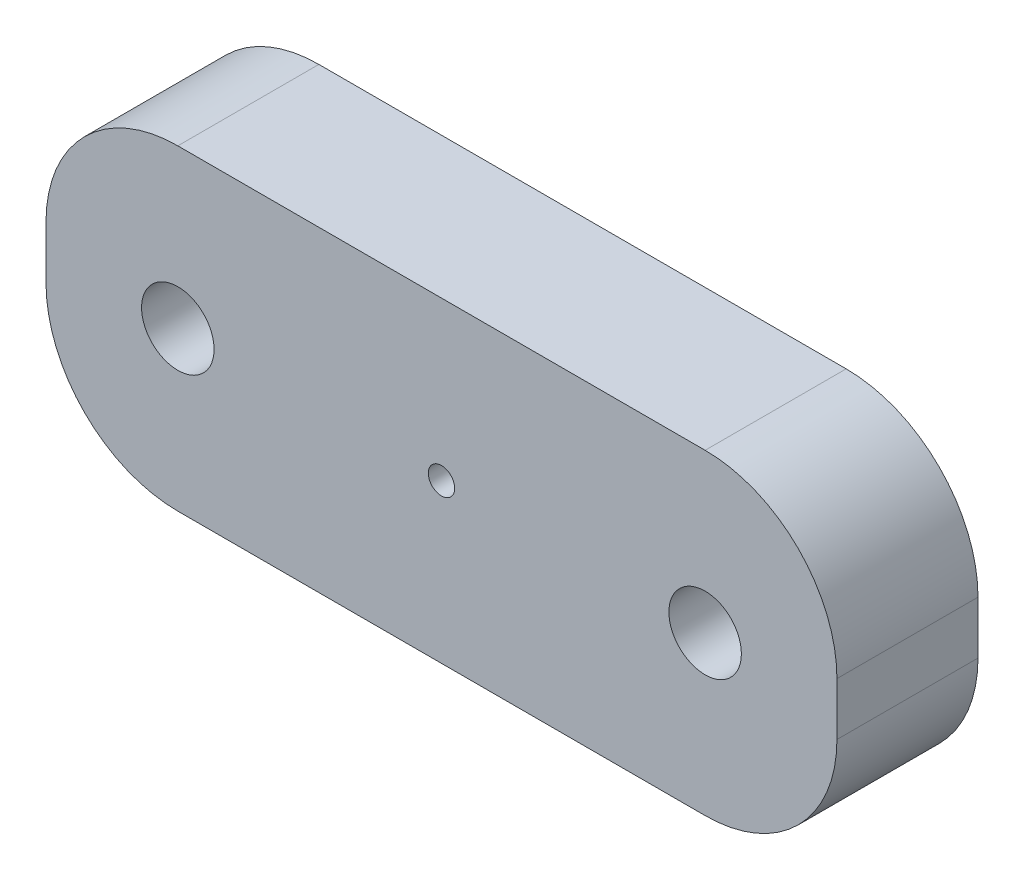
ISO-10303-21;
HEADER;
FILE_DESCRIPTION(('STEP AP214'),'2;1');
FILE_NAME('part.step','',(''),(''),'','','');
FILE_SCHEMA(('AUTOMOTIVE_DESIGN { 1 0 10303 214 1 1 1 1 }'));
ENDSEC;
DATA;
#1=APPLICATION_CONTEXT('core data for automotive mechanical design processes');
#2=APPLICATION_PROTOCOL_DEFINITION('international standard','automotive_design',2000,#1);
#3=PRODUCT_CONTEXT('',#1,'mechanical');
#4=PRODUCT('Part','Part','',(#3));
#5=PRODUCT_RELATED_PRODUCT_CATEGORY('part','',(#4));
#6=PRODUCT_DEFINITION_FORMATION('','',#4);
#7=PRODUCT_DEFINITION_CONTEXT('part definition',#1,'design');
#8=PRODUCT_DEFINITION('design','',#6,#7);
#9=PRODUCT_DEFINITION_SHAPE('','',#8);
#10=(LENGTH_UNIT() NAMED_UNIT(*) SI_UNIT(.MILLI.,.METRE.));
#11=(NAMED_UNIT(*) PLANE_ANGLE_UNIT() SI_UNIT($,.RADIAN.));
#12=(NAMED_UNIT(*) SI_UNIT($,.STERADIAN.) SOLID_ANGLE_UNIT());
#13=UNCERTAINTY_MEASURE_WITH_UNIT(LENGTH_MEASURE(1.E-05),#10,'distance_accuracy_value','');
#14=(GEOMETRIC_REPRESENTATION_CONTEXT(3) GLOBAL_UNCERTAINTY_ASSIGNED_CONTEXT((#13)) GLOBAL_UNIT_ASSIGNED_CONTEXT((#10,
#11,#12)) REPRESENTATION_CONTEXT('',''));
#15=CARTESIAN_POINT('',(0.,0.,0.));
#16=DIRECTION('',(0.,0.,1.));
#17=DIRECTION('',(1.,0.,0.));
#18=AXIS2_PLACEMENT_3D('',#15,#16,#17);
#19=CARTESIAN_POINT('',(0.,0.,5.35));
#20=DIRECTION('',(0.,1.,0.));
#21=DIRECTION('',(0.,0.,1.));
#22=AXIS2_PLACEMENT_3D('',#19,#20,#21);
#23=PLANE('',#22);
#24=DIRECTION('',(1.,0.,0.));
#25=VECTOR('',#24,1.);
#26=CARTESIAN_POINT('',(0.,0.,0.));
#27=LINE('',#26,#25);
#28=CARTESIAN_POINT('',(-10.,0.,0.));
#29=VERTEX_POINT('',#28);
#30=CARTESIAN_POINT('',(10.,0.,0.));
#31=VERTEX_POINT('',#30);
#32=EDGE_CURVE('E140',#29,#31,#27,.T.);
#33=ORIENTED_EDGE('',*,*,#32,.T.);
#34=DIRECTION('',(0.,0.,-1.));
#35=VECTOR('',#34,1.);
#36=CARTESIAN_POINT('',(10.,0.,5.35));
#37=LINE('',#36,#35);
#38=CARTESIAN_POINT('',(10.,0.,5.35));
#39=VERTEX_POINT('',#38);
#40=EDGE_CURVE('E11',#39,#31,#37,.T.);
#41=ORIENTED_EDGE('',*,*,#40,.F.);
#42=DIRECTION('',(1.,0.,0.));
#43=VECTOR('',#42,1.);
#44=CARTESIAN_POINT('',(0.,0.,5.35));
#45=LINE('',#44,#43);
#46=CARTESIAN_POINT('',(-10.,0.,5.35));
#47=VERTEX_POINT('',#46);
#48=EDGE_CURVE('E193',#47,#39,#45,.T.);
#49=ORIENTED_EDGE('',*,*,#48,.F.);
#50=DIRECTION('',(0.,0.,-1.));
#51=VECTOR('',#50,1.);
#52=CARTESIAN_POINT('',(-10.,0.,5.35));
#53=LINE('',#52,#51);
#54=EDGE_CURVE('E136',#47,#29,#53,.T.);
#55=ORIENTED_EDGE('',*,*,#54,.T.);
#56=EDGE_LOOP('',(#33,#41,#49,#55));
#57=FACE_BOUND('',#56,.T.);
#58=ADVANCED_FACE('F35',(#57),#23,.F.);
#59=CARTESIAN_POINT('',(10.,5.,5.35));
#60=DIRECTION('',(0.,0.,-1.));
#61=DIRECTION('',(-1.,0.,0.));
#62=AXIS2_PLACEMENT_3D('',#59,#60,#61);
#63=CYLINDRICAL_SURFACE('',#62,5.);
#64=CARTESIAN_POINT('',(10.,5.,0.));
#65=DIRECTION('',(0.,0.,1.));
#66=DIRECTION('',(1.,0.,0.));
#67=AXIS2_PLACEMENT_3D('',#64,#65,#66);
#68=CIRCLE('',#67,5.);
#69=CARTESIAN_POINT('',(15.,5.,0.));
#70=VERTEX_POINT('',#69);
#71=EDGE_CURVE('E143',#31,#70,#68,.T.);
#72=ORIENTED_EDGE('',*,*,#71,.T.);
#73=DIRECTION('',(0.,0.,-1.));
#74=VECTOR('',#73,1.);
#75=CARTESIAN_POINT('',(15.,5.,5.35));
#76=LINE('',#75,#74);
#77=CARTESIAN_POINT('',(15.,5.,5.35));
#78=VERTEX_POINT('',#77);
#79=EDGE_CURVE('E44',#78,#70,#76,.T.);
#80=ORIENTED_EDGE('',*,*,#79,.F.);
#81=CARTESIAN_POINT('',(10.,5.,5.35));
#82=DIRECTION('',(0.,0.,1.));
#83=DIRECTION('',(1.,0.,0.));
#84=AXIS2_PLACEMENT_3D('',#81,#82,#83);
#85=CIRCLE('',#84,5.);
#86=EDGE_CURVE('E91',#39,#78,#85,.T.);
#87=ORIENTED_EDGE('',*,*,#86,.F.);
#88=ORIENTED_EDGE('',*,*,#40,.T.);
#89=EDGE_LOOP('',(#72,#80,#87,#88));
#90=FACE_BOUND('',#89,.T.);
#91=ADVANCED_FACE('F212',(#90),#63,.T.);
#92=CARTESIAN_POINT('',(15.,0.,5.35));
#93=DIRECTION('',(-1.,0.,0.));
#94=DIRECTION('',(0.,-1.,0.));
#95=AXIS2_PLACEMENT_3D('',#92,#93,#94);
#96=PLANE('',#95);
#97=DIRECTION('',(0.,1.,0.));
#98=VECTOR('',#97,1.);
#99=CARTESIAN_POINT('',(15.,0.,0.));
#100=LINE('',#99,#98);
#101=CARTESIAN_POINT('',(15.,7.,0.));
#102=VERTEX_POINT('',#101);
#103=EDGE_CURVE('E145',#70,#102,#100,.T.);
#104=ORIENTED_EDGE('',*,*,#103,.T.);
#105=DIRECTION('',(0.,0.,-1.));
#106=VECTOR('',#105,1.);
#107=CARTESIAN_POINT('',(15.,7.,5.35));
#108=LINE('',#107,#106);
#109=CARTESIAN_POINT('',(15.,7.,5.35));
#110=VERTEX_POINT('',#109);
#111=EDGE_CURVE('E169',#110,#102,#108,.T.);
#112=ORIENTED_EDGE('',*,*,#111,.F.);
#113=DIRECTION('',(0.,1.,0.));
#114=VECTOR('',#113,1.);
#115=CARTESIAN_POINT('',(15.,0.,5.35));
#116=LINE('',#115,#114);
#117=EDGE_CURVE('E177',#78,#110,#116,.T.);
#118=ORIENTED_EDGE('',*,*,#117,.F.);
#119=ORIENTED_EDGE('',*,*,#79,.T.);
#120=EDGE_LOOP('',(#104,#112,#118,#119));
#121=FACE_BOUND('',#120,.T.);
#122=ADVANCED_FACE('F175',(#121),#96,.F.);
#123=CARTESIAN_POINT('',(10.,7.,5.35));
#124=DIRECTION('',(0.,0.,-1.));
#125=DIRECTION('',(-1.,0.,0.));
#126=AXIS2_PLACEMENT_3D('',#123,#124,#125);
#127=CYLINDRICAL_SURFACE('',#126,5.);
#128=CARTESIAN_POINT('',(10.,7.,0.));
#129=DIRECTION('',(0.,0.,1.));
#130=DIRECTION('',(1.,0.,0.));
#131=AXIS2_PLACEMENT_3D('',#128,#129,#130);
#132=CIRCLE('',#131,5.);
#133=CARTESIAN_POINT('',(10.,12.,0.));
#134=VERTEX_POINT('',#133);
#135=EDGE_CURVE('E147',#102,#134,#132,.T.);
#136=ORIENTED_EDGE('',*,*,#135,.T.);
#137=DIRECTION('',(0.,0.,-1.));
#138=VECTOR('',#137,1.);
#139=CARTESIAN_POINT('',(10.,12.,5.35));
#140=LINE('',#139,#138);
#141=CARTESIAN_POINT('',(10.,12.,5.35));
#142=VERTEX_POINT('',#141);
#143=EDGE_CURVE('E167',#142,#134,#140,.T.);
#144=ORIENTED_EDGE('',*,*,#143,.F.);
#145=CARTESIAN_POINT('',(10.,7.,5.35));
#146=DIRECTION('',(0.,0.,1.));
#147=DIRECTION('',(1.,0.,0.));
#148=AXIS2_PLACEMENT_3D('',#145,#146,#147);
#149=CIRCLE('',#148,5.);
#150=EDGE_CURVE('E188',#110,#142,#149,.T.);
#151=ORIENTED_EDGE('',*,*,#150,.F.);
#152=ORIENTED_EDGE('',*,*,#111,.T.);
#153=EDGE_LOOP('',(#136,#144,#151,#152));
#154=FACE_BOUND('',#153,.T.);
#155=ADVANCED_FACE('F186',(#154),#127,.T.);
#156=CARTESIAN_POINT('',(0.,12.,5.35));
#157=DIRECTION('',(0.,1.,0.));
#158=DIRECTION('',(0.,0.,1.));
#159=AXIS2_PLACEMENT_3D('',#156,#157,#158);
#160=PLANE('',#159);
#161=DIRECTION('',(1.,0.,0.));
#162=VECTOR('',#161,1.);
#163=CARTESIAN_POINT('',(0.,12.,0.));
#164=LINE('',#163,#162);
#165=CARTESIAN_POINT('',(-10.,12.,0.));
#166=VERTEX_POINT('',#165);
#167=EDGE_CURVE('E150',#166,#134,#164,.T.);
#168=ORIENTED_EDGE('',*,*,#167,.F.);
#169=DIRECTION('',(0.,0.,-1.));
#170=VECTOR('',#169,1.);
#171=CARTESIAN_POINT('',(-10.,12.,5.35));
#172=LINE('',#171,#170);
#173=CARTESIAN_POINT('',(-10.,12.,5.35));
#174=VERTEX_POINT('',#173);
#175=EDGE_CURVE('E123',#174,#166,#172,.T.);
#176=ORIENTED_EDGE('',*,*,#175,.F.);
#177=DIRECTION('',(1.,0.,0.));
#178=VECTOR('',#177,1.);
#179=CARTESIAN_POINT('',(0.,12.,5.35));
#180=LINE('',#179,#178);
#181=EDGE_CURVE('E112',#174,#142,#180,.T.);
#182=ORIENTED_EDGE('',*,*,#181,.T.);
#183=ORIENTED_EDGE('',*,*,#143,.T.);
#184=EDGE_LOOP('',(#168,#176,#182,#183));
#185=FACE_BOUND('',#184,.T.);
#186=ADVANCED_FACE('F223',(#185),#160,.T.);
#187=CARTESIAN_POINT('',(-10.,7.,5.35));
#188=DIRECTION('',(0.,0.,-1.));
#189=DIRECTION('',(-1.,0.,0.));
#190=AXIS2_PLACEMENT_3D('',#187,#188,#189);
#191=CYLINDRICAL_SURFACE('',#190,5.);
#192=CARTESIAN_POINT('',(-10.,7.,0.));
#193=DIRECTION('',(0.,0.,1.));
#194=DIRECTION('',(1.,0.,0.));
#195=AXIS2_PLACEMENT_3D('',#192,#193,#194);
#196=CIRCLE('',#195,5.);
#197=CARTESIAN_POINT('',(-15.,7.,0.));
#198=VERTEX_POINT('',#197);
#199=EDGE_CURVE('E119',#166,#198,#196,.T.);
#200=ORIENTED_EDGE('',*,*,#199,.T.);
#201=DIRECTION('',(0.,0.,-1.));
#202=VECTOR('',#201,1.);
#203=CARTESIAN_POINT('',(-15.,7.,5.35));
#204=LINE('',#203,#202);
#205=CARTESIAN_POINT('',(-15.,7.,5.35));
#206=VERTEX_POINT('',#205);
#207=EDGE_CURVE('E116',#206,#198,#204,.T.);
#208=ORIENTED_EDGE('',*,*,#207,.F.);
#209=CARTESIAN_POINT('',(-10.,7.,5.35));
#210=DIRECTION('',(0.,0.,1.));
#211=DIRECTION('',(1.,0.,0.));
#212=AXIS2_PLACEMENT_3D('',#209,#210,#211);
#213=CIRCLE('',#212,5.);
#214=EDGE_CURVE('E105',#174,#206,#213,.T.);
#215=ORIENTED_EDGE('',*,*,#214,.F.);
#216=ORIENTED_EDGE('',*,*,#175,.T.);
#217=EDGE_LOOP('',(#200,#208,#215,#216));
#218=FACE_BOUND('',#217,.T.);
#219=ADVANCED_FACE('F117',(#218),#191,.T.);
#220=CARTESIAN_POINT('',(-15.,0.,5.35));
#221=DIRECTION('',(-1.,0.,0.));
#222=DIRECTION('',(0.,-1.,0.));
#223=AXIS2_PLACEMENT_3D('',#220,#221,#222);
#224=PLANE('',#223);
#225=DIRECTION('',(0.,1.,0.));
#226=VECTOR('',#225,1.);
#227=CARTESIAN_POINT('',(-15.,0.,0.));
#228=LINE('',#227,#226);
#229=CARTESIAN_POINT('',(-15.,5.,0.));
#230=VERTEX_POINT('',#229);
#231=EDGE_CURVE('E154',#230,#198,#228,.T.);
#232=ORIENTED_EDGE('',*,*,#231,.F.);
#233=DIRECTION('',(0.,0.,-1.));
#234=VECTOR('',#233,1.);
#235=CARTESIAN_POINT('',(-15.,5.,5.35));
#236=LINE('',#235,#234);
#237=CARTESIAN_POINT('',(-15.,5.,5.35));
#238=VERTEX_POINT('',#237);
#239=EDGE_CURVE('E80',#238,#230,#236,.T.);
#240=ORIENTED_EDGE('',*,*,#239,.F.);
#241=DIRECTION('',(0.,1.,0.));
#242=VECTOR('',#241,1.);
#243=CARTESIAN_POINT('',(-15.,0.,5.35));
#244=LINE('',#243,#242);
#245=EDGE_CURVE('E110',#238,#206,#244,.T.);
#246=ORIENTED_EDGE('',*,*,#245,.T.);
#247=ORIENTED_EDGE('',*,*,#207,.T.);
#248=EDGE_LOOP('',(#232,#240,#246,#247));
#249=FACE_BOUND('',#248,.T.);
#250=ADVANCED_FACE('F125',(#249),#224,.T.);
#251=CARTESIAN_POINT('',(-10.,6.,5.35));
#252=DIRECTION('',(0.,0.,-1.));
#253=DIRECTION('',(-1.,0.,0.));
#254=AXIS2_PLACEMENT_3D('',#251,#252,#253);
#255=CYLINDRICAL_SURFACE('',#254,1.375);
#256=CARTESIAN_POINT('',(-10.,6.,5.35));
#257=DIRECTION('',(0.,0.,1.));
#258=DIRECTION('',(1.,0.,0.));
#259=AXIS2_PLACEMENT_3D('',#256,#257,#258);
#260=CIRCLE('',#259,1.375);
#261=CARTESIAN_POINT('',(-8.625,6.,5.35));
#262=VERTEX_POINT('',#261);
#263=EDGE_CURVE('E127',#262,#262,#260,.T.);
#264=ORIENTED_EDGE('',*,*,#263,.T.);
#265=EDGE_LOOP('',(#264));
#266=FACE_BOUND('',#265,.T.);
#267=CARTESIAN_POINT('',(-10.,6.,0.));
#268=DIRECTION('',(0.,0.,1.));
#269=DIRECTION('',(1.,0.,0.));
#270=AXIS2_PLACEMENT_3D('',#267,#268,#269);
#271=CIRCLE('',#270,1.375);
#272=CARTESIAN_POINT('',(-8.625,6.,0.));
#273=VERTEX_POINT('',#272);
#274=EDGE_CURVE('E157',#273,#273,#271,.T.);
#275=ORIENTED_EDGE('',*,*,#274,.F.);
#276=EDGE_LOOP('',(#275));
#277=FACE_BOUND('',#276,.T.);
#278=ADVANCED_FACE('F231',(#266,#277),#255,.F.);
#279=CARTESIAN_POINT('',(-10.,5.,5.35));
#280=DIRECTION('',(0.,0.,-1.));
#281=DIRECTION('',(-1.,0.,0.));
#282=AXIS2_PLACEMENT_3D('',#279,#280,#281);
#283=CYLINDRICAL_SURFACE('',#282,5.);
#284=CARTESIAN_POINT('',(-10.,5.,0.));
#285=DIRECTION('',(0.,0.,1.));
#286=DIRECTION('',(1.,0.,0.));
#287=AXIS2_PLACEMENT_3D('',#284,#285,#286);
#288=CIRCLE('',#287,5.);
#289=EDGE_CURVE('E83',#230,#29,#288,.T.);
#290=ORIENTED_EDGE('',*,*,#289,.T.);
#291=ORIENTED_EDGE('',*,*,#54,.F.);
#292=CARTESIAN_POINT('',(-10.,5.,5.35));
#293=DIRECTION('',(0.,0.,1.));
#294=DIRECTION('',(1.,0.,0.));
#295=AXIS2_PLACEMENT_3D('',#292,#293,#294);
#296=CIRCLE('',#295,5.);
#297=EDGE_CURVE('E52',#238,#47,#296,.T.);
#298=ORIENTED_EDGE('',*,*,#297,.F.);
#299=ORIENTED_EDGE('',*,*,#239,.T.);
#300=EDGE_LOOP('',(#290,#291,#298,#299));
#301=FACE_BOUND('',#300,.T.);
#302=ADVANCED_FACE('F232',(#301),#283,.T.);
#303=CARTESIAN_POINT('',(0.,6.,5.35));
#304=DIRECTION('',(0.,0.,-1.));
#305=DIRECTION('',(-1.,0.,0.));
#306=AXIS2_PLACEMENT_3D('',#303,#304,#305);
#307=CYLINDRICAL_SURFACE('',#306,0.5);
#308=CARTESIAN_POINT('',(0.,6.,5.35));
#309=DIRECTION('',(0.,0.,1.));
#310=DIRECTION('',(1.,0.,0.));
#311=AXIS2_PLACEMENT_3D('',#308,#309,#310);
#312=CIRCLE('',#311,0.5);
#313=CARTESIAN_POINT('',(0.5,6.,5.35));
#314=VERTEX_POINT('',#313);
#315=EDGE_CURVE('E163',#314,#314,#312,.T.);
#316=ORIENTED_EDGE('',*,*,#315,.T.);
#317=EDGE_LOOP('',(#316));
#318=FACE_BOUND('',#317,.T.);
#319=CARTESIAN_POINT('',(0.,6.,0.));
#320=DIRECTION('',(0.,0.,1.));
#321=DIRECTION('',(1.,0.,0.));
#322=AXIS2_PLACEMENT_3D('',#319,#320,#321);
#323=CIRCLE('',#322,0.5);
#324=CARTESIAN_POINT('',(0.5,6.,0.));
#325=VERTEX_POINT('',#324);
#326=EDGE_CURVE('E137',#325,#325,#323,.T.);
#327=ORIENTED_EDGE('',*,*,#326,.F.);
#328=EDGE_LOOP('',(#327));
#329=FACE_BOUND('',#328,.T.);
#330=ADVANCED_FACE('F37',(#318,#329),#307,.F.);
#331=CARTESIAN_POINT('',(10.,6.,5.35));
#332=DIRECTION('',(0.,0.,-1.));
#333=DIRECTION('',(-1.,0.,0.));
#334=AXIS2_PLACEMENT_3D('',#331,#332,#333);
#335=CYLINDRICAL_SURFACE('',#334,1.375);
#336=CARTESIAN_POINT('',(10.,6.,5.35));
#337=DIRECTION('',(0.,0.,1.));
#338=DIRECTION('',(1.,0.,0.));
#339=AXIS2_PLACEMENT_3D('',#336,#337,#338);
#340=CIRCLE('',#339,1.375);
#341=CARTESIAN_POINT('',(11.375,6.,5.35));
#342=VERTEX_POINT('',#341);
#343=EDGE_CURVE('E133',#342,#342,#340,.F.);
#344=ORIENTED_EDGE('',*,*,#343,.F.);
#345=EDGE_LOOP('',(#344));
#346=FACE_BOUND('',#345,.T.);
#347=CARTESIAN_POINT('',(10.,6.,0.));
#348=DIRECTION('',(0.,0.,1.));
#349=DIRECTION('',(1.,0.,0.));
#350=AXIS2_PLACEMENT_3D('',#347,#348,#349);
#351=CIRCLE('',#350,1.375);
#352=CARTESIAN_POINT('',(11.375,6.,0.));
#353=VERTEX_POINT('',#352);
#354=EDGE_CURVE('E160',#353,#353,#351,.F.);
#355=ORIENTED_EDGE('',*,*,#354,.T.);
#356=EDGE_LOOP('',(#355));
#357=FACE_BOUND('',#356,.T.);
#358=ADVANCED_FACE('F201',(#346,#357),#335,.F.);
#359=CARTESIAN_POINT('',(0.,0.,5.35));
#360=DIRECTION('',(0.,0.,1.));
#361=DIRECTION('',(1.,0.,0.));
#362=AXIS2_PLACEMENT_3D('',#359,#360,#361);
#363=PLANE('',#362);
#364=ORIENTED_EDGE('',*,*,#315,.F.);
#365=EDGE_LOOP('',(#364));
#366=FACE_BOUND('',#365,.T.);
#367=ORIENTED_EDGE('',*,*,#48,.T.);
#368=ORIENTED_EDGE('',*,*,#86,.T.);
#369=ORIENTED_EDGE('',*,*,#117,.T.);
#370=ORIENTED_EDGE('',*,*,#150,.T.);
#371=ORIENTED_EDGE('',*,*,#181,.F.);
#372=ORIENTED_EDGE('',*,*,#214,.T.);
#373=ORIENTED_EDGE('',*,*,#245,.F.);
#374=ORIENTED_EDGE('',*,*,#297,.T.);
#375=EDGE_LOOP('',(#367,#368,#369,#370,#371,#372,#373,#374));
#376=FACE_BOUND('',#375,.T.);
#377=ORIENTED_EDGE('',*,*,#263,.F.);
#378=EDGE_LOOP('',(#377));
#379=FACE_BOUND('',#378,.T.);
#380=ORIENTED_EDGE('',*,*,#343,.T.);
#381=EDGE_LOOP('',(#380));
#382=FACE_BOUND('',#381,.T.);
#383=ADVANCED_FACE('F107',(#366,#376,#379,#382),#363,.T.);
#384=CARTESIAN_POINT('',(0.,0.,0.));
#385=DIRECTION('',(0.,0.,1.));
#386=DIRECTION('',(1.,0.,0.));
#387=AXIS2_PLACEMENT_3D('',#384,#385,#386);
#388=PLANE('',#387);
#389=ORIENTED_EDGE('',*,*,#326,.T.);
#390=EDGE_LOOP('',(#389));
#391=FACE_BOUND('',#390,.T.);
#392=ORIENTED_EDGE('',*,*,#32,.F.);
#393=ORIENTED_EDGE('',*,*,#289,.F.);
#394=ORIENTED_EDGE('',*,*,#231,.T.);
#395=ORIENTED_EDGE('',*,*,#199,.F.);
#396=ORIENTED_EDGE('',*,*,#167,.T.);
#397=ORIENTED_EDGE('',*,*,#135,.F.);
#398=ORIENTED_EDGE('',*,*,#103,.F.);
#399=ORIENTED_EDGE('',*,*,#71,.F.);
#400=EDGE_LOOP('',(#392,#393,#394,#395,#396,#397,#398,#399));
#401=FACE_BOUND('',#400,.T.);
#402=ORIENTED_EDGE('',*,*,#274,.T.);
#403=EDGE_LOOP('',(#402));
#404=FACE_BOUND('',#403,.T.);
#405=ORIENTED_EDGE('',*,*,#354,.F.);
#406=EDGE_LOOP('',(#405));
#407=FACE_BOUND('',#406,.T.);
#408=ADVANCED_FACE('F181',(#391,#401,#404,#407),#388,.F.);
#409=CLOSED_SHELL('',(#58,#91,#122,#155,#186,#219,#250,#278,#302,#330,#358,#383,#408));
#410=MANIFOLD_SOLID_BREP('B2',#409);
#411=ADVANCED_BREP_SHAPE_REPRESENTATION('',(#18,#410),#14);
#412=SHAPE_DEFINITION_REPRESENTATION(#9,#411);
ENDSEC;
END-ISO-10303-21;
